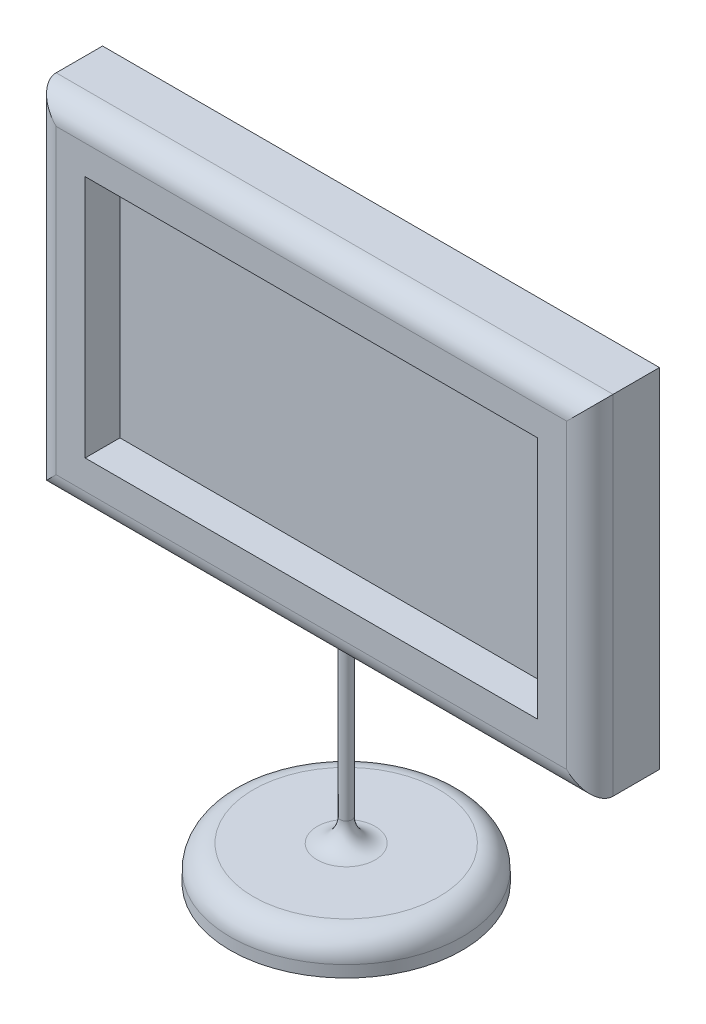
ISO-10303-21;
HEADER;
FILE_DESCRIPTION(('STEP AP214'),'2;1');
FILE_NAME('part.step','',(''),(''),'','','');
FILE_SCHEMA(('AUTOMOTIVE_DESIGN { 1 0 10303 214 1 1 1 1 }'));
ENDSEC;
DATA;
#1=APPLICATION_CONTEXT('core data for automotive mechanical design processes');
#2=APPLICATION_PROTOCOL_DEFINITION('international standard','automotive_design',2000,#1);
#3=PRODUCT_CONTEXT('',#1,'mechanical');
#4=PRODUCT('Part','Part','',(#3));
#5=PRODUCT_RELATED_PRODUCT_CATEGORY('part','',(#4));
#6=PRODUCT_DEFINITION_FORMATION('','',#4);
#7=PRODUCT_DEFINITION_CONTEXT('part definition',#1,'design');
#8=PRODUCT_DEFINITION('design','',#6,#7);
#9=PRODUCT_DEFINITION_SHAPE('','',#8);
#10=(LENGTH_UNIT() NAMED_UNIT(*) SI_UNIT(.MILLI.,.METRE.));
#11=(NAMED_UNIT(*) PLANE_ANGLE_UNIT() SI_UNIT($,.RADIAN.));
#12=(NAMED_UNIT(*) SI_UNIT($,.STERADIAN.) SOLID_ANGLE_UNIT());
#13=UNCERTAINTY_MEASURE_WITH_UNIT(LENGTH_MEASURE(1.E-05),#10,'distance_accuracy_value','');
#14=(GEOMETRIC_REPRESENTATION_CONTEXT(3) GLOBAL_UNCERTAINTY_ASSIGNED_CONTEXT((#13)) GLOBAL_UNIT_ASSIGNED_CONTEXT((#10,
#11,#12)) REPRESENTATION_CONTEXT('',''));
#15=CARTESIAN_POINT('',(0.,0.,0.));
#16=DIRECTION('',(0.,0.,1.));
#17=DIRECTION('',(1.,0.,0.));
#18=AXIS2_PLACEMENT_3D('',#15,#16,#17);
#19=CARTESIAN_POINT('',(0.,15.,0.));
#20=DIRECTION('',(0.,-1.,0.));
#21=DIRECTION('',(0.,0.,-1.));
#22=AXIS2_PLACEMENT_3D('',#19,#20,#21);
#23=CYLINDRICAL_SURFACE('',#22,50.);
#24=CARTESIAN_POINT('',(0.,5.,0.));
#25=DIRECTION('',(0.,1.,0.));
#26=DIRECTION('',(0.,0.,1.));
#27=AXIS2_PLACEMENT_3D('',#24,#25,#26);
#28=CIRCLE('',#27,50.);
#29=CARTESIAN_POINT('',(0.,5.,50.));
#30=VERTEX_POINT('',#29);
#31=EDGE_CURVE('E193',#30,#30,#28,.F.);
#32=ORIENTED_EDGE('',*,*,#31,.T.);
#33=EDGE_LOOP('',(#32));
#34=FACE_BOUND('',#33,.T.);
#35=CARTESIAN_POINT('',(0.,0.,0.));
#36=DIRECTION('',(0.,1.,0.));
#37=DIRECTION('',(0.,0.,1.));
#38=AXIS2_PLACEMENT_3D('',#35,#36,#37);
#39=CIRCLE('',#38,50.);
#40=CARTESIAN_POINT('',(0.,0.,50.));
#41=VERTEX_POINT('',#40);
#42=EDGE_CURVE('E187',#41,#41,#39,.T.);
#43=ORIENTED_EDGE('',*,*,#42,.T.);
#44=EDGE_LOOP('',(#43));
#45=FACE_BOUND('',#44,.T.);
#46=ADVANCED_FACE('F35',(#34,#45),#23,.T.);
#47=CARTESIAN_POINT('',(0.,15.,0.));
#48=DIRECTION('',(0.,1.,0.));
#49=DIRECTION('',(0.,0.,1.));
#50=AXIS2_PLACEMENT_3D('',#47,#48,#49);
#51=PLANE('',#50);
#52=CARTESIAN_POINT('',(0.,15.,0.));
#53=DIRECTION('',(0.,1.,0.));
#54=DIRECTION('',(0.,0.,1.));
#55=AXIS2_PLACEMENT_3D('',#52,#53,#54);
#56=CIRCLE('',#55,12.5);
#57=CARTESIAN_POINT('',(0.,15.,12.5));
#58=VERTEX_POINT('',#57);
#59=EDGE_CURVE('E199',#58,#58,#56,.F.);
#60=ORIENTED_EDGE('',*,*,#59,.T.);
#61=EDGE_LOOP('',(#60));
#62=FACE_BOUND('',#61,.T.);
#63=CARTESIAN_POINT('',(0.,15.,0.));
#64=DIRECTION('',(0.,1.,0.));
#65=DIRECTION('',(0.,0.,1.));
#66=AXIS2_PLACEMENT_3D('',#63,#64,#65);
#67=CIRCLE('',#66,40.);
#68=CARTESIAN_POINT('',(0.,15.,40.));
#69=VERTEX_POINT('',#68);
#70=EDGE_CURVE('E190',#69,#69,#67,.T.);
#71=ORIENTED_EDGE('',*,*,#70,.T.);
#72=EDGE_LOOP('',(#71));
#73=FACE_BOUND('',#72,.T.);
#74=ADVANCED_FACE('F269',(#62,#73),#51,.T.);
#75=CARTESIAN_POINT('',(0.,0.,0.));
#76=DIRECTION('',(0.,1.,0.));
#77=DIRECTION('',(0.,0.,1.));
#78=AXIS2_PLACEMENT_3D('',#75,#76,#77);
#79=PLANE('',#78);
#80=CARTESIAN_POINT('',(0.,0.,0.));
#81=DIRECTION('',(0.,-1.,0.));
#82=DIRECTION('',(0.,0.,-1.));
#83=AXIS2_PLACEMENT_3D('',#80,#81,#82);
#84=CIRCLE('',#83,40.);
#85=CARTESIAN_POINT('',(0.,0.,-40.));
#86=VERTEX_POINT('',#85);
#87=EDGE_CURVE('E184',#86,#86,#84,.T.);
#88=ORIENTED_EDGE('',*,*,#87,.F.);
#89=EDGE_LOOP('',(#88));
#90=FACE_BOUND('',#89,.T.);
#91=ORIENTED_EDGE('',*,*,#42,.F.);
#92=EDGE_LOOP('',(#91));
#93=FACE_BOUND('',#92,.T.);
#94=ADVANCED_FACE('F275',(#90,#93),#79,.F.);
#95=CARTESIAN_POINT('',(0.,5.,0.));
#96=DIRECTION('',(0.,1.,0.));
#97=DIRECTION('',(0.,0.,1.));
#98=AXIS2_PLACEMENT_3D('',#95,#96,#97);
#99=TOROIDAL_SURFACE('',#98,40.,10.);
#100=ORIENTED_EDGE('',*,*,#31,.F.);
#101=EDGE_LOOP('',(#100));
#102=FACE_BOUND('',#101,.T.);
#103=ORIENTED_EDGE('',*,*,#70,.F.);
#104=EDGE_LOOP('',(#103));
#105=FACE_BOUND('',#104,.T.);
#106=ADVANCED_FACE('F281',(#102,#105),#99,.T.);
#107=CARTESIAN_POINT('',(0.,0.,0.));
#108=DIRECTION('',(0.,-1.,0.));
#109=DIRECTION('',(0.,0.,-1.));
#110=AXIS2_PLACEMENT_3D('',#107,#108,#109);
#111=CYLINDRICAL_SURFACE('',#110,40.);
#112=CARTESIAN_POINT('',(0.,5.,0.));
#113=DIRECTION('',(0.,-1.,0.));
#114=DIRECTION('',(0.,0.,-1.));
#115=AXIS2_PLACEMENT_3D('',#112,#113,#114);
#116=CIRCLE('',#115,40.);
#117=CARTESIAN_POINT('',(0.,5.,-40.));
#118=VERTEX_POINT('',#117);
#119=EDGE_CURVE('E181',#118,#118,#116,.T.);
#120=ORIENTED_EDGE('',*,*,#119,.F.);
#121=EDGE_LOOP('',(#120));
#122=FACE_BOUND('',#121,.T.);
#123=ORIENTED_EDGE('',*,*,#87,.T.);
#124=EDGE_LOOP('',(#123));
#125=FACE_BOUND('',#124,.T.);
#126=ADVANCED_FACE('F284',(#122,#125),#111,.F.);
#127=CARTESIAN_POINT('',(0.,5.,0.));
#128=DIRECTION('',(0.,-1.,0.));
#129=DIRECTION('',(0.,0.,-1.));
#130=AXIS2_PLACEMENT_3D('',#127,#128,#129);
#131=TOROIDAL_SURFACE('',#130,35.,5.);
#132=CARTESIAN_POINT('',(0.,10.,0.));
#133=DIRECTION('',(0.,-1.,0.));
#134=DIRECTION('',(0.,0.,-1.));
#135=AXIS2_PLACEMENT_3D('',#132,#133,#134);
#136=CIRCLE('',#135,35.);
#137=CARTESIAN_POINT('',(0.,10.,-35.));
#138=VERTEX_POINT('',#137);
#139=EDGE_CURVE('E178',#138,#138,#136,.T.);
#140=ORIENTED_EDGE('',*,*,#139,.F.);
#141=EDGE_LOOP('',(#140));
#142=FACE_BOUND('',#141,.T.);
#143=ORIENTED_EDGE('',*,*,#119,.T.);
#144=EDGE_LOOP('',(#143));
#145=FACE_BOUND('',#144,.T.);
#146=ADVANCED_FACE('F327',(#142,#145),#131,.F.);
#147=CARTESIAN_POINT('',(0.,10.,0.));
#148=DIRECTION('',(0.,1.,0.));
#149=DIRECTION('',(0.,0.,1.));
#150=AXIS2_PLACEMENT_3D('',#147,#148,#149);
#151=PLANE('',#150);
#152=ORIENTED_EDGE('',*,*,#139,.T.);
#153=EDGE_LOOP('',(#152));
#154=FACE_BOUND('',#153,.T.);
#155=ADVANCED_FACE('F323',(#154),#151,.F.);
#156=CARTESIAN_POINT('',(0.,95.,0.));
#157=DIRECTION('',(0.,-1.,0.));
#158=DIRECTION('',(0.,0.,-1.));
#159=AXIS2_PLACEMENT_3D('',#156,#157,#158);
#160=CYLINDRICAL_SURFACE('',#159,2.5);
#161=CARTESIAN_POINT('',(0.,25.,0.));
#162=DIRECTION('',(0.,1.,0.));
#163=DIRECTION('',(0.,0.,1.));
#164=AXIS2_PLACEMENT_3D('',#161,#162,#163);
#165=CIRCLE('',#164,2.5);
#166=CARTESIAN_POINT('',(0.,25.,2.5));
#167=VERTEX_POINT('',#166);
#168=EDGE_CURVE('E196',#167,#167,#165,.T.);
#169=ORIENTED_EDGE('',*,*,#168,.T.);
#170=EDGE_LOOP('',(#169));
#171=FACE_BOUND('',#170,.T.);
#172=CARTESIAN_POINT('',(0.,95.,0.));
#173=DIRECTION('',(0.,1.,0.));
#174=DIRECTION('',(0.,0.,1.));
#175=AXIS2_PLACEMENT_3D('',#172,#173,#174);
#176=CIRCLE('',#175,2.5);
#177=CARTESIAN_POINT('',(0.,95.,2.5));
#178=VERTEX_POINT('',#177);
#179=EDGE_CURVE('E175',#178,#178,#176,.T.);
#180=ORIENTED_EDGE('',*,*,#179,.F.);
#181=EDGE_LOOP('',(#180));
#182=FACE_BOUND('',#181,.T.);
#183=ADVANCED_FACE('F290',(#171,#182),#160,.T.);
#184=CARTESIAN_POINT('',(0.,25.,0.));
#185=DIRECTION('',(0.,1.,0.));
#186=DIRECTION('',(0.,0.,1.));
#187=AXIS2_PLACEMENT_3D('',#184,#185,#186);
#188=TOROIDAL_SURFACE('',#187,12.5,10.);
#189=ORIENTED_EDGE('',*,*,#59,.F.);
#190=EDGE_LOOP('',(#189));
#191=FACE_BOUND('',#190,.T.);
#192=ORIENTED_EDGE('',*,*,#168,.F.);
#193=EDGE_LOOP('',(#192));
#194=FACE_BOUND('',#193,.T.);
#195=ADVANCED_FACE('F286',(#191,#194),#188,.F.);
#196=CARTESIAN_POINT('',(-120.,245.,15.));
#197=DIRECTION('',(1.,0.,0.));
#198=DIRECTION('',(0.,1.,0.));
#199=AXIS2_PLACEMENT_3D('',#196,#197,#198);
#200=PLANE('',#199);
#201=DIRECTION('',(0.,0.,-1.));
#202=VECTOR('',#201,1.);
#203=CARTESIAN_POINT('',(-120.,95.,15.));
#204=LINE('',#203,#202);
#205=CARTESIAN_POINT('',(-120.,95.,5.));
#206=VERTEX_POINT('',#205);
#207=CARTESIAN_POINT('',(-120.,95.,-15.));
#208=VERTEX_POINT('',#207);
#209=EDGE_CURVE('E173',#206,#208,#204,.T.);
#210=ORIENTED_EDGE('',*,*,#209,.F.);
#211=DIRECTION('',(0.,-1.,0.));
#212=VECTOR('',#211,1.);
#213=CARTESIAN_POINT('',(-120.,245.,5.));
#214=LINE('',#213,#212);
#215=CARTESIAN_POINT('',(-120.,245.,5.));
#216=VERTEX_POINT('',#215);
#217=EDGE_CURVE('E59',#206,#216,#214,.F.);
#218=ORIENTED_EDGE('',*,*,#217,.T.);
#219=DIRECTION('',(0.,0.,-1.));
#220=VECTOR('',#219,1.);
#221=CARTESIAN_POINT('',(-120.,245.,15.));
#222=LINE('',#221,#220);
#223=CARTESIAN_POINT('',(-120.,245.,-15.));
#224=VERTEX_POINT('',#223);
#225=EDGE_CURVE('E167',#216,#224,#222,.T.);
#226=ORIENTED_EDGE('',*,*,#225,.T.);
#227=DIRECTION('',(0.,-1.,0.));
#228=VECTOR('',#227,1.);
#229=CARTESIAN_POINT('',(-120.,245.,-15.));
#230=LINE('',#229,#228);
#231=EDGE_CURVE('E152',#224,#208,#230,.T.);
#232=ORIENTED_EDGE('',*,*,#231,.T.);
#233=EDGE_LOOP('',(#210,#218,#226,#232));
#234=FACE_BOUND('',#233,.T.);
#235=ADVANCED_FACE('F289',(#234),#200,.F.);
#236=CARTESIAN_POINT('',(-120.,95.,15.));
#237=DIRECTION('',(0.,1.,0.));
#238=DIRECTION('',(0.,0.,1.));
#239=AXIS2_PLACEMENT_3D('',#236,#237,#238);
#240=PLANE('',#239);
#241=ORIENTED_EDGE('',*,*,#179,.T.);
#242=EDGE_LOOP('',(#241));
#243=FACE_BOUND('',#242,.T.);
#244=DIRECTION('',(0.,0.,-1.));
#245=VECTOR('',#244,1.);
#246=CARTESIAN_POINT('',(120.,95.,15.));
#247=LINE('',#246,#245);
#248=CARTESIAN_POINT('',(120.,95.,5.));
#249=VERTEX_POINT('',#248);
#250=CARTESIAN_POINT('',(120.,95.,-15.));
#251=VERTEX_POINT('',#250);
#252=EDGE_CURVE('E171',#249,#251,#247,.T.);
#253=ORIENTED_EDGE('',*,*,#252,.F.);
#254=DIRECTION('',(1.,0.,0.));
#255=VECTOR('',#254,1.);
#256=CARTESIAN_POINT('',(-120.,95.,5.));
#257=LINE('',#256,#255);
#258=EDGE_CURVE('E211',#249,#206,#257,.F.);
#259=ORIENTED_EDGE('',*,*,#258,.T.);
#260=ORIENTED_EDGE('',*,*,#209,.T.);
#261=DIRECTION('',(1.,0.,0.));
#262=VECTOR('',#261,1.);
#263=CARTESIAN_POINT('',(-120.,95.,-15.));
#264=LINE('',#263,#262);
#265=EDGE_CURVE('E158',#208,#251,#264,.T.);
#266=ORIENTED_EDGE('',*,*,#265,.T.);
#267=EDGE_LOOP('',(#253,#259,#260,#266));
#268=FACE_BOUND('',#267,.T.);
#269=ADVANCED_FACE('F240',(#243,#268),#240,.F.);
#270=CARTESIAN_POINT('',(120.,245.,15.));
#271=DIRECTION('',(-1.,0.,0.));
#272=DIRECTION('',(0.,-1.,0.));
#273=AXIS2_PLACEMENT_3D('',#270,#271,#272);
#274=PLANE('',#273);
#275=DIRECTION('',(0.,0.,-1.));
#276=VECTOR('',#275,1.);
#277=CARTESIAN_POINT('',(120.,245.,15.));
#278=LINE('',#277,#276);
#279=CARTESIAN_POINT('',(120.,245.,5.));
#280=VERTEX_POINT('',#279);
#281=CARTESIAN_POINT('',(120.,245.,-15.));
#282=VERTEX_POINT('',#281);
#283=EDGE_CURVE('E169',#280,#282,#278,.T.);
#284=ORIENTED_EDGE('',*,*,#283,.F.);
#285=DIRECTION('',(0.,1.,0.));
#286=VECTOR('',#285,1.);
#287=CARTESIAN_POINT('',(120.,95.,5.));
#288=LINE('',#287,#286);
#289=EDGE_CURVE('E11',#280,#249,#288,.F.);
#290=ORIENTED_EDGE('',*,*,#289,.T.);
#291=ORIENTED_EDGE('',*,*,#252,.T.);
#292=DIRECTION('',(0.,1.,0.));
#293=VECTOR('',#292,1.);
#294=CARTESIAN_POINT('',(120.,245.,-15.));
#295=LINE('',#294,#293);
#296=EDGE_CURVE('E161',#251,#282,#295,.T.);
#297=ORIENTED_EDGE('',*,*,#296,.T.);
#298=EDGE_LOOP('',(#284,#290,#291,#297));
#299=FACE_BOUND('',#298,.T.);
#300=ADVANCED_FACE('F237',(#299),#274,.F.);
#301=CARTESIAN_POINT('',(-120.,245.,15.));
#302=DIRECTION('',(0.,-1.,0.));
#303=DIRECTION('',(0.,0.,-1.));
#304=AXIS2_PLACEMENT_3D('',#301,#302,#303);
#305=PLANE('',#304);
#306=ORIENTED_EDGE('',*,*,#225,.F.);
#307=DIRECTION('',(-1.,0.,0.));
#308=VECTOR('',#307,1.);
#309=CARTESIAN_POINT('',(120.,245.,5.));
#310=LINE('',#309,#308);
#311=EDGE_CURVE('E44',#216,#280,#310,.F.);
#312=ORIENTED_EDGE('',*,*,#311,.T.);
#313=ORIENTED_EDGE('',*,*,#283,.T.);
#314=DIRECTION('',(-1.,0.,0.));
#315=VECTOR('',#314,1.);
#316=CARTESIAN_POINT('',(-120.,245.,-15.));
#317=LINE('',#316,#315);
#318=EDGE_CURVE('E164',#282,#224,#317,.T.);
#319=ORIENTED_EDGE('',*,*,#318,.T.);
#320=EDGE_LOOP('',(#306,#312,#313,#319));
#321=FACE_BOUND('',#320,.T.);
#322=ADVANCED_FACE('F251',(#321),#305,.F.);
#323=CARTESIAN_POINT('',(0.,0.,15.));
#324=DIRECTION('',(0.,0.,1.));
#325=DIRECTION('',(1.,0.,0.));
#326=AXIS2_PLACEMENT_3D('',#323,#324,#325);
#327=PLANE('',#326);
#328=DIRECTION('',(0.,-1.,0.));
#329=VECTOR('',#328,1.);
#330=CARTESIAN_POINT('',(-110.,95.,15.));
#331=LINE('',#330,#329);
#332=CARTESIAN_POINT('',(-110.,235.,15.));
#333=VERTEX_POINT('',#332);
#334=CARTESIAN_POINT('',(-110.,105.,15.));
#335=VERTEX_POINT('',#334);
#336=EDGE_CURVE('E206',#333,#335,#331,.T.);
#337=ORIENTED_EDGE('',*,*,#336,.T.);
#338=DIRECTION('',(1.,0.,0.));
#339=VECTOR('',#338,1.);
#340=CARTESIAN_POINT('',(120.,105.,15.));
#341=LINE('',#340,#339);
#342=CARTESIAN_POINT('',(110.,105.,15.));
#343=VERTEX_POINT('',#342);
#344=EDGE_CURVE('E208',#335,#343,#341,.T.);
#345=ORIENTED_EDGE('',*,*,#344,.T.);
#346=DIRECTION('',(0.,1.,0.));
#347=VECTOR('',#346,1.);
#348=CARTESIAN_POINT('',(110.,245.,15.));
#349=LINE('',#348,#347);
#350=CARTESIAN_POINT('',(110.,235.,15.));
#351=VERTEX_POINT('',#350);
#352=EDGE_CURVE('E202',#343,#351,#349,.T.);
#353=ORIENTED_EDGE('',*,*,#352,.T.);
#354=DIRECTION('',(-1.,0.,0.));
#355=VECTOR('',#354,1.);
#356=CARTESIAN_POINT('',(-120.,235.,15.));
#357=LINE('',#356,#355);
#358=EDGE_CURVE('E204',#351,#333,#357,.T.);
#359=ORIENTED_EDGE('',*,*,#358,.T.);
#360=EDGE_LOOP('',(#337,#345,#353,#359));
#361=FACE_BOUND('',#360,.T.);
#362=DIRECTION('',(0.,-1.,0.));
#363=VECTOR('',#362,1.);
#364=CARTESIAN_POINT('',(-97.5,222.5,15.));
#365=LINE('',#364,#363);
#366=CARTESIAN_POINT('',(-97.5,222.5,15.));
#367=VERTEX_POINT('',#366);
#368=CARTESIAN_POINT('',(-97.5,117.5,15.));
#369=VERTEX_POINT('',#368);
#370=EDGE_CURVE('E120',#367,#369,#365,.T.);
#371=ORIENTED_EDGE('',*,*,#370,.F.);
#372=DIRECTION('',(-1.,0.,0.));
#373=VECTOR('',#372,1.);
#374=CARTESIAN_POINT('',(-97.5,222.5,15.));
#375=LINE('',#374,#373);
#376=CARTESIAN_POINT('',(97.5,222.5,15.));
#377=VERTEX_POINT('',#376);
#378=EDGE_CURVE('E137',#377,#367,#375,.T.);
#379=ORIENTED_EDGE('',*,*,#378,.F.);
#380=DIRECTION('',(0.,1.,0.));
#381=VECTOR('',#380,1.);
#382=CARTESIAN_POINT('',(97.5,222.5,15.));
#383=LINE('',#382,#381);
#384=CARTESIAN_POINT('',(97.5,117.5,15.));
#385=VERTEX_POINT('',#384);
#386=EDGE_CURVE('E140',#385,#377,#383,.T.);
#387=ORIENTED_EDGE('',*,*,#386,.F.);
#388=DIRECTION('',(1.,0.,0.));
#389=VECTOR('',#388,1.);
#390=CARTESIAN_POINT('',(-97.5,117.5,15.));
#391=LINE('',#390,#389);
#392=EDGE_CURVE('E146',#369,#385,#391,.T.);
#393=ORIENTED_EDGE('',*,*,#392,.F.);
#394=EDGE_LOOP('',(#371,#379,#387,#393));
#395=FACE_BOUND('',#394,.T.);
#396=ADVANCED_FACE('F247',(#361,#395),#327,.T.);
#397=CARTESIAN_POINT('',(0.,0.,-15.));
#398=DIRECTION('',(0.,0.,1.));
#399=DIRECTION('',(1.,0.,0.));
#400=AXIS2_PLACEMENT_3D('',#397,#398,#399);
#401=PLANE('',#400);
#402=ORIENTED_EDGE('',*,*,#231,.F.);
#403=ORIENTED_EDGE('',*,*,#318,.F.);
#404=ORIENTED_EDGE('',*,*,#296,.F.);
#405=ORIENTED_EDGE('',*,*,#265,.F.);
#406=EDGE_LOOP('',(#402,#403,#404,#405));
#407=FACE_BOUND('',#406,.T.);
#408=ADVANCED_FACE('F250',(#407),#401,.F.);
#409=CARTESIAN_POINT('',(-97.5,222.5,0.));
#410=DIRECTION('',(-1.,0.,0.));
#411=DIRECTION('',(0.,-1.,0.));
#412=AXIS2_PLACEMENT_3D('',#409,#410,#411);
#413=PLANE('',#412);
#414=ORIENTED_EDGE('',*,*,#370,.T.);
#415=DIRECTION('',(0.,0.,1.));
#416=VECTOR('',#415,1.);
#417=CARTESIAN_POINT('',(-97.5,117.5,0.));
#418=LINE('',#417,#416);
#419=CARTESIAN_POINT('',(-97.5,117.5,0.));
#420=VERTEX_POINT('',#419);
#421=EDGE_CURVE('E113',#420,#369,#418,.T.);
#422=ORIENTED_EDGE('',*,*,#421,.F.);
#423=DIRECTION('',(0.,-1.,0.));
#424=VECTOR('',#423,1.);
#425=CARTESIAN_POINT('',(-97.5,222.5,0.));
#426=LINE('',#425,#424);
#427=CARTESIAN_POINT('',(-97.5,222.5,0.));
#428=VERTEX_POINT('',#427);
#429=EDGE_CURVE('E117',#428,#420,#426,.T.);
#430=ORIENTED_EDGE('',*,*,#429,.F.);
#431=DIRECTION('',(0.,0.,1.));
#432=VECTOR('',#431,1.);
#433=CARTESIAN_POINT('',(-97.5,222.5,0.));
#434=LINE('',#433,#432);
#435=EDGE_CURVE('E150',#428,#367,#434,.T.);
#436=ORIENTED_EDGE('',*,*,#435,.T.);
#437=EDGE_LOOP('',(#414,#422,#430,#436));
#438=FACE_BOUND('',#437,.T.);
#439=ADVANCED_FACE('F115',(#438),#413,.F.);
#440=CARTESIAN_POINT('',(-97.5,222.5,0.));
#441=DIRECTION('',(0.,1.,0.));
#442=DIRECTION('',(0.,0.,1.));
#443=AXIS2_PLACEMENT_3D('',#440,#441,#442);
#444=PLANE('',#443);
#445=ORIENTED_EDGE('',*,*,#378,.T.);
#446=ORIENTED_EDGE('',*,*,#435,.F.);
#447=DIRECTION('',(-1.,0.,0.));
#448=VECTOR('',#447,1.);
#449=CARTESIAN_POINT('',(-97.5,222.5,0.));
#450=LINE('',#449,#448);
#451=CARTESIAN_POINT('',(97.5,222.5,0.));
#452=VERTEX_POINT('',#451);
#453=EDGE_CURVE('E125',#452,#428,#450,.T.);
#454=ORIENTED_EDGE('',*,*,#453,.F.);
#455=DIRECTION('',(0.,0.,1.));
#456=VECTOR('',#455,1.);
#457=CARTESIAN_POINT('',(97.5,222.5,0.));
#458=LINE('',#457,#456);
#459=EDGE_CURVE('E153',#452,#377,#458,.T.);
#460=ORIENTED_EDGE('',*,*,#459,.T.);
#461=EDGE_LOOP('',(#445,#446,#454,#460));
#462=FACE_BOUND('',#461,.T.);
#463=ADVANCED_FACE('F258',(#462),#444,.F.);
#464=CARTESIAN_POINT('',(97.5,222.5,0.));
#465=DIRECTION('',(1.,0.,0.));
#466=DIRECTION('',(0.,1.,0.));
#467=AXIS2_PLACEMENT_3D('',#464,#465,#466);
#468=PLANE('',#467);
#469=ORIENTED_EDGE('',*,*,#386,.T.);
#470=ORIENTED_EDGE('',*,*,#459,.F.);
#471=DIRECTION('',(0.,1.,0.));
#472=VECTOR('',#471,1.);
#473=CARTESIAN_POINT('',(97.5,222.5,0.));
#474=LINE('',#473,#472);
#475=CARTESIAN_POINT('',(97.5,117.5,0.));
#476=VERTEX_POINT('',#475);
#477=EDGE_CURVE('E133',#476,#452,#474,.T.);
#478=ORIENTED_EDGE('',*,*,#477,.F.);
#479=DIRECTION('',(0.,0.,1.));
#480=VECTOR('',#479,1.);
#481=CARTESIAN_POINT('',(97.5,117.5,0.));
#482=LINE('',#481,#480);
#483=EDGE_CURVE('E124',#476,#385,#482,.T.);
#484=ORIENTED_EDGE('',*,*,#483,.T.);
#485=EDGE_LOOP('',(#469,#470,#478,#484));
#486=FACE_BOUND('',#485,.T.);
#487=ADVANCED_FACE('F256',(#486),#468,.F.);
#488=CARTESIAN_POINT('',(-97.5,117.5,0.));
#489=DIRECTION('',(0.,-1.,0.));
#490=DIRECTION('',(0.,0.,-1.));
#491=AXIS2_PLACEMENT_3D('',#488,#489,#490);
#492=PLANE('',#491);
#493=ORIENTED_EDGE('',*,*,#392,.T.);
#494=ORIENTED_EDGE('',*,*,#483,.F.);
#495=DIRECTION('',(1.,0.,0.));
#496=VECTOR('',#495,1.);
#497=CARTESIAN_POINT('',(-97.5,117.5,0.));
#498=LINE('',#497,#496);
#499=EDGE_CURVE('E128',#420,#476,#498,.T.);
#500=ORIENTED_EDGE('',*,*,#499,.F.);
#501=ORIENTED_EDGE('',*,*,#421,.T.);
#502=EDGE_LOOP('',(#493,#494,#500,#501));
#503=FACE_BOUND('',#502,.T.);
#504=ADVANCED_FACE('F129',(#503),#492,.F.);
#505=CARTESIAN_POINT('',(0.,0.,0.));
#506=DIRECTION('',(0.,0.,1.));
#507=DIRECTION('',(1.,0.,0.));
#508=AXIS2_PLACEMENT_3D('',#505,#506,#507);
#509=PLANE('',#508);
#510=ORIENTED_EDGE('',*,*,#429,.T.);
#511=ORIENTED_EDGE('',*,*,#499,.T.);
#512=ORIENTED_EDGE('',*,*,#477,.T.);
#513=ORIENTED_EDGE('',*,*,#453,.T.);
#514=EDGE_LOOP('',(#510,#511,#512,#513));
#515=FACE_BOUND('',#514,.T.);
#516=ADVANCED_FACE('F135',(#515),#509,.T.);
#517=CARTESIAN_POINT('',(0.,235.,5.));
#518=DIRECTION('',(1.,0.,0.));
#519=DIRECTION('',(0.,0.,-1.));
#520=AXIS2_PLACEMENT_3D('',#517,#518,#519);
#521=CYLINDRICAL_SURFACE('',#520,10.);
#522=CARTESIAN_POINT('',(110.,235.,5.));
#523=DIRECTION('',(0.707106781186548,-0.707106781186547,0.));
#524=DIRECTION('',(-0.707106781186547,-0.707106781186548,0.));
#525=AXIS2_PLACEMENT_3D('',#522,#523,#524);
#526=ELLIPSE('',#525,14.1421356237309,10.);
#527=EDGE_CURVE('E219',#280,#351,#526,.T.);
#528=ORIENTED_EDGE('',*,*,#527,.F.);
#529=ORIENTED_EDGE('',*,*,#311,.F.);
#530=CARTESIAN_POINT('',(-110.,235.,5.));
#531=DIRECTION('',(0.707106781186547,0.707106781186547,0.));
#532=DIRECTION('',(0.707106781186547,-0.707106781186548,0.));
#533=AXIS2_PLACEMENT_3D('',#530,#531,#532);
#534=ELLIPSE('',#533,14.1421356237309,10.);
#535=EDGE_CURVE('E39',#333,#216,#534,.F.);
#536=ORIENTED_EDGE('',*,*,#535,.F.);
#537=ORIENTED_EDGE('',*,*,#358,.F.);
#538=EDGE_LOOP('',(#528,#529,#536,#537));
#539=FACE_BOUND('',#538,.T.);
#540=ADVANCED_FACE('F37',(#539),#521,.T.);
#541=CARTESIAN_POINT('',(-110.,0.,5.));
#542=DIRECTION('',(0.,1.,0.));
#543=DIRECTION('',(-1.,0.,0.));
#544=AXIS2_PLACEMENT_3D('',#541,#542,#543);
#545=CYLINDRICAL_SURFACE('',#544,10.);
#546=ORIENTED_EDGE('',*,*,#535,.T.);
#547=ORIENTED_EDGE('',*,*,#217,.F.);
#548=CARTESIAN_POINT('',(-110.,105.,5.));
#549=DIRECTION('',(-0.707106781186547,0.707106781186548,0.));
#550=DIRECTION('',(0.707106781186547,0.707106781186547,0.));
#551=AXIS2_PLACEMENT_3D('',#548,#549,#550);
#552=ELLIPSE('',#551,14.142135623731,10.);
#553=EDGE_CURVE('E218',#335,#206,#552,.F.);
#554=ORIENTED_EDGE('',*,*,#553,.F.);
#555=ORIENTED_EDGE('',*,*,#336,.F.);
#556=EDGE_LOOP('',(#546,#547,#554,#555));
#557=FACE_BOUND('',#556,.T.);
#558=ADVANCED_FACE('F229',(#557),#545,.T.);
#559=CARTESIAN_POINT('',(110.,0.,5.));
#560=DIRECTION('',(0.,-1.,0.));
#561=DIRECTION('',(1.,0.,0.));
#562=AXIS2_PLACEMENT_3D('',#559,#560,#561);
#563=CYLINDRICAL_SURFACE('',#562,10.);
#564=ORIENTED_EDGE('',*,*,#527,.T.);
#565=ORIENTED_EDGE('',*,*,#352,.F.);
#566=CARTESIAN_POINT('',(110.,105.,5.));
#567=DIRECTION('',(-0.707106781186547,-0.707106781186548,0.));
#568=DIRECTION('',(0.707106781186548,-0.707106781186547,0.));
#569=AXIS2_PLACEMENT_3D('',#566,#567,#568);
#570=ELLIPSE('',#569,14.142135623731,10.);
#571=EDGE_CURVE('E216',#249,#343,#570,.T.);
#572=ORIENTED_EDGE('',*,*,#571,.F.);
#573=ORIENTED_EDGE('',*,*,#289,.F.);
#574=EDGE_LOOP('',(#564,#565,#572,#573));
#575=FACE_BOUND('',#574,.T.);
#576=ADVANCED_FACE('F234',(#575),#563,.T.);
#577=CARTESIAN_POINT('',(0.,105.,5.));
#578=DIRECTION('',(-1.,0.,0.));
#579=DIRECTION('',(0.,0.,1.));
#580=AXIS2_PLACEMENT_3D('',#577,#578,#579);
#581=CYLINDRICAL_SURFACE('',#580,10.);
#582=ORIENTED_EDGE('',*,*,#553,.T.);
#583=ORIENTED_EDGE('',*,*,#258,.F.);
#584=ORIENTED_EDGE('',*,*,#571,.T.);
#585=ORIENTED_EDGE('',*,*,#344,.F.);
#586=EDGE_LOOP('',(#582,#583,#584,#585));
#587=FACE_BOUND('',#586,.T.);
#588=ADVANCED_FACE('F244',(#587),#581,.T.);
#589=CLOSED_SHELL('',(#46,#74,#94,#106,#126,#146,#155,#183,#195,#235,#269,#300,#322,#396,#408,
#439,#463,#487,#504,#516,#540,#558,#576,#588));
#590=MANIFOLD_SOLID_BREP('B2',#589);
#591=ADVANCED_BREP_SHAPE_REPRESENTATION('',(#18,#590),#14);
#592=SHAPE_DEFINITION_REPRESENTATION(#9,#591);
ENDSEC;
END-ISO-10303-21;
